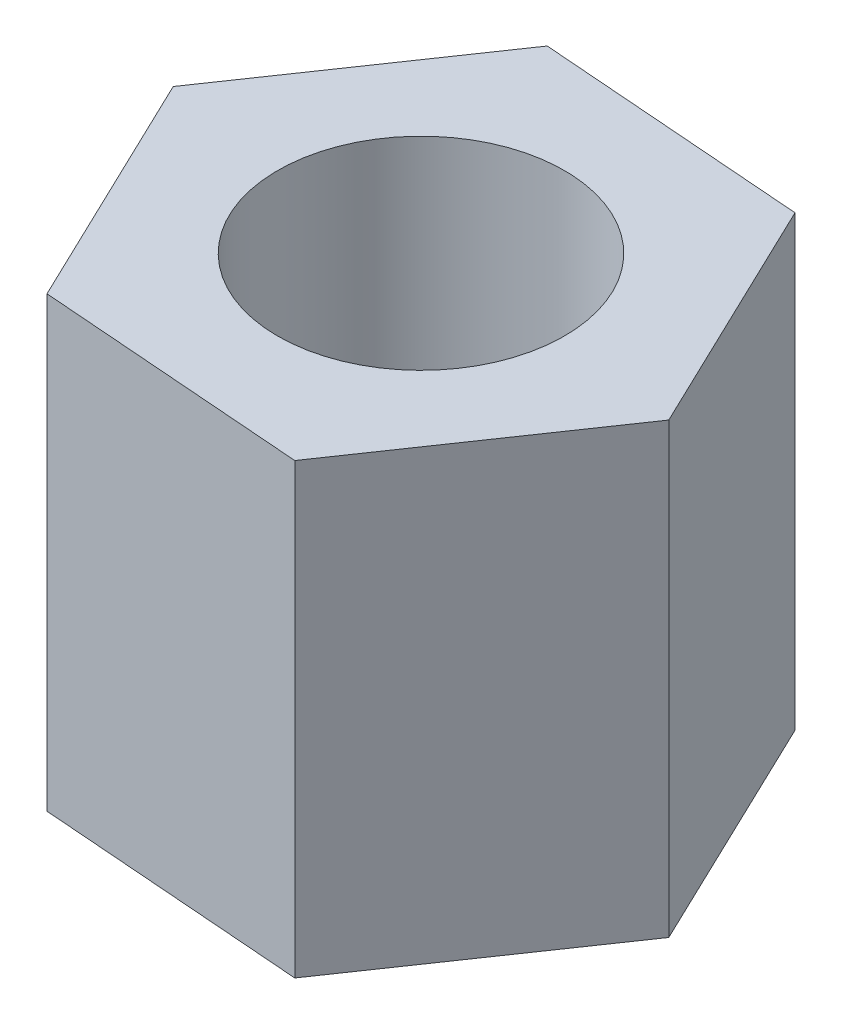
ISO-10303-21;
HEADER;
FILE_DESCRIPTION(('STEP AP214'),'2;1');
FILE_NAME('part.step','',(''),(''),'','','');
FILE_SCHEMA(('AUTOMOTIVE_DESIGN { 1 0 10303 214 1 1 1 1 }'));
ENDSEC;
DATA;
#1=APPLICATION_CONTEXT('core data for automotive mechanical design processes');
#2=APPLICATION_PROTOCOL_DEFINITION('international standard','automotive_design',2000,#1);
#3=PRODUCT_CONTEXT('',#1,'mechanical');
#4=PRODUCT('Part','Part','',(#3));
#5=PRODUCT_RELATED_PRODUCT_CATEGORY('part','',(#4));
#6=PRODUCT_DEFINITION_FORMATION('','',#4);
#7=PRODUCT_DEFINITION_CONTEXT('part definition',#1,'design');
#8=PRODUCT_DEFINITION('design','',#6,#7);
#9=PRODUCT_DEFINITION_SHAPE('','',#8);
#10=(LENGTH_UNIT() NAMED_UNIT(*) SI_UNIT(.MILLI.,.METRE.));
#11=(NAMED_UNIT(*) PLANE_ANGLE_UNIT() SI_UNIT($,.RADIAN.));
#12=(NAMED_UNIT(*) SI_UNIT($,.STERADIAN.) SOLID_ANGLE_UNIT());
#13=UNCERTAINTY_MEASURE_WITH_UNIT(LENGTH_MEASURE(1.E-05),#10,'distance_accuracy_value','');
#14=(GEOMETRIC_REPRESENTATION_CONTEXT(3) GLOBAL_UNCERTAINTY_ASSIGNED_CONTEXT((#13)) GLOBAL_UNIT_ASSIGNED_CONTEXT((#10,
#11,#12)) REPRESENTATION_CONTEXT('',''));
#15=CARTESIAN_POINT('',(0.,0.,0.));
#16=DIRECTION('',(0.,0.,1.));
#17=DIRECTION('',(1.,0.,0.));
#18=AXIS2_PLACEMENT_3D('',#15,#16,#17);
#19=CARTESIAN_POINT('',(0.,5.,0.));
#20=DIRECTION('',(0.,1.,0.));
#21=DIRECTION('',(0.,0.,1.));
#22=AXIS2_PLACEMENT_3D('',#19,#20,#21);
#23=PLANE('',#22);
#24=DIRECTION('',(0.997087277509707,0.,0.0762690043745235));
#25=VECTOR('',#24,1.);
#26=CARTESIAN_POINT('',(-1.69503779237079,5.,2.47793870298845));
#27=LINE('',#26,#25);
#28=CARTESIAN_POINT('',(-1.69503779237079,5.,2.47793870298845));
#29=VERTEX_POINT('',#28);
#30=CARTESIAN_POINT('',(1.29843896962327,5.,2.70691514006202));
#31=VERTEX_POINT('',#30);
#32=EDGE_CURVE('E152',#29,#31,#27,.T.);
#33=ORIENTED_EDGE('',*,*,#32,.T.);
#34=DIRECTION('',(0.564594534064537,0.,-0.825368409926409));
#35=VECTOR('',#34,1.);
#36=CARTESIAN_POINT('',(1.29843896962327,5.,2.70691514006202));
#37=LINE('',#36,#35);
#38=CARTESIAN_POINT('',(2.99347676199406,5.,0.22897643707357));
#39=VERTEX_POINT('',#38);
#40=EDGE_CURVE('E100',#31,#39,#37,.T.);
#41=ORIENTED_EDGE('',*,*,#40,.T.);
#42=DIRECTION('',(-0.43249274344517,0.,-0.901637414300932));
#43=VECTOR('',#42,1.);
#44=CARTESIAN_POINT('',(2.99347676199406,5.,0.22897643707357));
#45=LINE('',#44,#43);
#46=CARTESIAN_POINT('',(1.69503779237079,5.,-2.47793870298845));
#47=VERTEX_POINT('',#46);
#48=EDGE_CURVE('E113',#39,#47,#45,.T.);
#49=ORIENTED_EDGE('',*,*,#48,.T.);
#50=DIRECTION('',(-0.997087277509707,0.,-0.0762690043745234));
#51=VECTOR('',#50,1.);
#52=CARTESIAN_POINT('',(1.69503779237079,5.,-2.47793870298845));
#53=LINE('',#52,#51);
#54=CARTESIAN_POINT('',(-1.29843896962327,5.,-2.70691514006202));
#55=VERTEX_POINT('',#54);
#56=EDGE_CURVE('E107',#47,#55,#53,.T.);
#57=ORIENTED_EDGE('',*,*,#56,.T.);
#58=DIRECTION('',(-0.564594534064537,0.,0.825368409926409));
#59=VECTOR('',#58,1.);
#60=CARTESIAN_POINT('',(-1.29843896962327,5.,-2.70691514006202));
#61=LINE('',#60,#59);
#62=CARTESIAN_POINT('',(-2.99347676199406,5.,-0.228976437073569));
#63=VERTEX_POINT('',#62);
#64=EDGE_CURVE('E111',#55,#63,#61,.T.);
#65=ORIENTED_EDGE('',*,*,#64,.T.);
#66=DIRECTION('',(0.43249274344517,0.,0.901637414300932));
#67=VECTOR('',#66,1.);
#68=CARTESIAN_POINT('',(-2.99347676199406,5.,-0.228976437073569));
#69=LINE('',#68,#67);
#70=EDGE_CURVE('E63',#63,#29,#69,.T.);
#71=ORIENTED_EDGE('',*,*,#70,.T.);
#72=EDGE_LOOP('',(#33,#41,#49,#57,#65,#71));
#73=FACE_BOUND('',#72,.T.);
#74=CARTESIAN_POINT('',(0.,5.,0.));
#75=DIRECTION('',(0.,1.,0.));
#76=DIRECTION('',(0.,0.,1.));
#77=AXIS2_PLACEMENT_3D('',#74,#75,#76);
#78=CIRCLE('',#77,1.6);
#79=CARTESIAN_POINT('',(0.,5.,1.6));
#80=VERTEX_POINT('',#79);
#81=EDGE_CURVE('E140',#80,#80,#78,.T.);
#82=ORIENTED_EDGE('',*,*,#81,.F.);
#83=EDGE_LOOP('',(#82));
#84=FACE_BOUND('',#83,.T.);
#85=ADVANCED_FACE('F45',(#73,#84),#23,.T.);
#86=CARTESIAN_POINT('',(0.,0.,0.));
#87=DIRECTION('',(0.,1.,0.));
#88=DIRECTION('',(0.,0.,1.));
#89=AXIS2_PLACEMENT_3D('',#86,#87,#88);
#90=PLANE('',#89);
#91=DIRECTION('',(0.997087277509707,0.,0.0762690043745235));
#92=VECTOR('',#91,1.);
#93=CARTESIAN_POINT('',(-1.69503779237079,0.,2.47793870298845));
#94=LINE('',#93,#92);
#95=CARTESIAN_POINT('',(-1.69503779237079,0.,2.47793870298845));
#96=VERTEX_POINT('',#95);
#97=CARTESIAN_POINT('',(1.29843896962327,0.,2.70691514006202));
#98=VERTEX_POINT('',#97);
#99=EDGE_CURVE('E135',#96,#98,#94,.T.);
#100=ORIENTED_EDGE('',*,*,#99,.F.);
#101=DIRECTION('',(0.43249274344517,0.,0.901637414300932));
#102=VECTOR('',#101,1.);
#103=CARTESIAN_POINT('',(-2.99347676199406,0.,-0.228976437073569));
#104=LINE('',#103,#102);
#105=CARTESIAN_POINT('',(-2.99347676199406,0.,-0.228976437073569));
#106=VERTEX_POINT('',#105);
#107=EDGE_CURVE('E92',#106,#96,#104,.T.);
#108=ORIENTED_EDGE('',*,*,#107,.F.);
#109=DIRECTION('',(-0.564594534064537,0.,0.825368409926409));
#110=VECTOR('',#109,1.);
#111=CARTESIAN_POINT('',(-1.29843896962327,0.,-2.70691514006202));
#112=LINE('',#111,#110);
#113=CARTESIAN_POINT('',(-1.29843896962327,0.,-2.70691514006202));
#114=VERTEX_POINT('',#113);
#115=EDGE_CURVE('E86',#114,#106,#112,.T.);
#116=ORIENTED_EDGE('',*,*,#115,.F.);
#117=DIRECTION('',(-0.997087277509707,0.,-0.0762690043745234));
#118=VECTOR('',#117,1.);
#119=CARTESIAN_POINT('',(1.69503779237079,0.,-2.47793870298845));
#120=LINE('',#119,#118);
#121=CARTESIAN_POINT('',(1.69503779237079,0.,-2.47793870298845));
#122=VERTEX_POINT('',#121);
#123=EDGE_CURVE('E122',#122,#114,#120,.T.);
#124=ORIENTED_EDGE('',*,*,#123,.F.);
#125=DIRECTION('',(-0.43249274344517,0.,-0.901637414300932));
#126=VECTOR('',#125,1.);
#127=CARTESIAN_POINT('',(2.99347676199406,0.,0.22897643707357));
#128=LINE('',#127,#126);
#129=CARTESIAN_POINT('',(2.99347676199406,0.,0.22897643707357));
#130=VERTEX_POINT('',#129);
#131=EDGE_CURVE('E143',#130,#122,#128,.T.);
#132=ORIENTED_EDGE('',*,*,#131,.F.);
#133=DIRECTION('',(0.564594534064537,0.,-0.825368409926409));
#134=VECTOR('',#133,1.);
#135=CARTESIAN_POINT('',(1.29843896962327,0.,2.70691514006202));
#136=LINE('',#135,#134);
#137=EDGE_CURVE('E139',#98,#130,#136,.T.);
#138=ORIENTED_EDGE('',*,*,#137,.F.);
#139=EDGE_LOOP('',(#100,#108,#116,#124,#132,#138));
#140=FACE_BOUND('',#139,.T.);
#141=CARTESIAN_POINT('',(0.,0.,0.));
#142=DIRECTION('',(0.,1.,0.));
#143=DIRECTION('',(0.,0.,1.));
#144=AXIS2_PLACEMENT_3D('',#141,#142,#143);
#145=CIRCLE('',#144,1.6);
#146=CARTESIAN_POINT('',(0.,0.,1.6));
#147=VERTEX_POINT('',#146);
#148=EDGE_CURVE('E249',#147,#147,#145,.T.);
#149=ORIENTED_EDGE('',*,*,#148,.T.);
#150=EDGE_LOOP('',(#149));
#151=FACE_BOUND('',#150,.T.);
#152=ADVANCED_FACE('F165',(#140,#151),#90,.F.);
#153=CARTESIAN_POINT('',(-1.69503779237079,5.,2.47793870298845));
#154=DIRECTION('',(0.0762690043745235,0.,-0.997087277509707));
#155=DIRECTION('',(-0.997087277509707,0.,-0.0762690043745235));
#156=AXIS2_PLACEMENT_3D('',#153,#154,#155);
#157=PLANE('',#156);
#158=ORIENTED_EDGE('',*,*,#99,.T.);
#159=DIRECTION('',(0.,-1.,0.));
#160=VECTOR('',#159,1.);
#161=CARTESIAN_POINT('',(1.29843896962327,5.,2.70691514006202));
#162=LINE('',#161,#160);
#163=EDGE_CURVE('E11',#31,#98,#162,.T.);
#164=ORIENTED_EDGE('',*,*,#163,.F.);
#165=ORIENTED_EDGE('',*,*,#32,.F.);
#166=DIRECTION('',(0.,-1.,0.));
#167=VECTOR('',#166,1.);
#168=CARTESIAN_POINT('',(-1.69503779237079,5.,2.47793870298845));
#169=LINE('',#168,#167);
#170=EDGE_CURVE('E131',#29,#96,#169,.T.);
#171=ORIENTED_EDGE('',*,*,#170,.T.);
#172=EDGE_LOOP('',(#158,#164,#165,#171));
#173=FACE_BOUND('',#172,.T.);
#174=ADVANCED_FACE('F47',(#173),#157,.F.);
#175=CARTESIAN_POINT('',(1.29843896962327,5.,2.70691514006202));
#176=DIRECTION('',(-0.825368409926409,0.,-0.564594534064537));
#177=DIRECTION('',(-0.564594534064537,0.,0.825368409926409));
#178=AXIS2_PLACEMENT_3D('',#175,#176,#177);
#179=PLANE('',#178);
#180=ORIENTED_EDGE('',*,*,#137,.T.);
#181=DIRECTION('',(0.,-1.,0.));
#182=VECTOR('',#181,1.);
#183=CARTESIAN_POINT('',(2.99347676199406,5.,0.22897643707357));
#184=LINE('',#183,#182);
#185=EDGE_CURVE('E55',#39,#130,#184,.T.);
#186=ORIENTED_EDGE('',*,*,#185,.F.);
#187=ORIENTED_EDGE('',*,*,#40,.F.);
#188=ORIENTED_EDGE('',*,*,#163,.T.);
#189=EDGE_LOOP('',(#180,#186,#187,#188));
#190=FACE_BOUND('',#189,.T.);
#191=ADVANCED_FACE('F190',(#190),#179,.F.);
#192=CARTESIAN_POINT('',(2.99347676199406,5.,0.22897643707357));
#193=DIRECTION('',(-0.901637414300932,0.,0.43249274344517));
#194=DIRECTION('',(0.43249274344517,0.,0.901637414300932));
#195=AXIS2_PLACEMENT_3D('',#192,#193,#194);
#196=PLANE('',#195);
#197=ORIENTED_EDGE('',*,*,#131,.T.);
#198=DIRECTION('',(0.,-1.,0.));
#199=VECTOR('',#198,1.);
#200=CARTESIAN_POINT('',(1.69503779237079,5.,-2.47793870298845));
#201=LINE('',#200,#199);
#202=EDGE_CURVE('E124',#47,#122,#201,.T.);
#203=ORIENTED_EDGE('',*,*,#202,.F.);
#204=ORIENTED_EDGE('',*,*,#48,.F.);
#205=ORIENTED_EDGE('',*,*,#185,.T.);
#206=EDGE_LOOP('',(#197,#203,#204,#205));
#207=FACE_BOUND('',#206,.T.);
#208=ADVANCED_FACE('F162',(#207),#196,.F.);
#209=CARTESIAN_POINT('',(1.69503779237079,5.,-2.47793870298845));
#210=DIRECTION('',(-0.0762690043745234,0.,0.997087277509707));
#211=DIRECTION('',(0.997087277509707,0.,0.0762690043745234));
#212=AXIS2_PLACEMENT_3D('',#209,#210,#211);
#213=PLANE('',#212);
#214=ORIENTED_EDGE('',*,*,#123,.T.);
#215=DIRECTION('',(0.,-1.,0.));
#216=VECTOR('',#215,1.);
#217=CARTESIAN_POINT('',(-1.29843896962327,5.,-2.70691514006202));
#218=LINE('',#217,#216);
#219=EDGE_CURVE('E119',#55,#114,#218,.T.);
#220=ORIENTED_EDGE('',*,*,#219,.F.);
#221=ORIENTED_EDGE('',*,*,#56,.F.);
#222=ORIENTED_EDGE('',*,*,#202,.T.);
#223=EDGE_LOOP('',(#214,#220,#221,#222));
#224=FACE_BOUND('',#223,.T.);
#225=ADVANCED_FACE('F120',(#224),#213,.F.);
#226=CARTESIAN_POINT('',(-1.29843896962327,5.,-2.70691514006202));
#227=DIRECTION('',(0.825368409926409,0.,0.564594534064537));
#228=DIRECTION('',(0.564594534064537,0.,-0.825368409926409));
#229=AXIS2_PLACEMENT_3D('',#226,#227,#228);
#230=PLANE('',#229);
#231=ORIENTED_EDGE('',*,*,#115,.T.);
#232=DIRECTION('',(0.,-1.,0.));
#233=VECTOR('',#232,1.);
#234=CARTESIAN_POINT('',(-2.99347676199406,5.,-0.228976437073569));
#235=LINE('',#234,#233);
#236=EDGE_CURVE('E125',#63,#106,#235,.T.);
#237=ORIENTED_EDGE('',*,*,#236,.F.);
#238=ORIENTED_EDGE('',*,*,#64,.F.);
#239=ORIENTED_EDGE('',*,*,#219,.T.);
#240=EDGE_LOOP('',(#231,#237,#238,#239));
#241=FACE_BOUND('',#240,.T.);
#242=ADVANCED_FACE('F127',(#241),#230,.F.);
#243=CARTESIAN_POINT('',(-2.99347676199406,5.,-0.228976437073569));
#244=DIRECTION('',(0.901637414300932,0.,-0.43249274344517));
#245=DIRECTION('',(-0.43249274344517,0.,-0.901637414300932));
#246=AXIS2_PLACEMENT_3D('',#243,#244,#245);
#247=PLANE('',#246);
#248=ORIENTED_EDGE('',*,*,#107,.T.);
#249=ORIENTED_EDGE('',*,*,#170,.F.);
#250=ORIENTED_EDGE('',*,*,#70,.F.);
#251=ORIENTED_EDGE('',*,*,#236,.T.);
#252=EDGE_LOOP('',(#248,#249,#250,#251));
#253=FACE_BOUND('',#252,.T.);
#254=ADVANCED_FACE('F170',(#253),#247,.F.);
#255=CARTESIAN_POINT('',(0.,5.,0.));
#256=DIRECTION('',(0.,-1.,0.));
#257=DIRECTION('',(0.,0.,-1.));
#258=AXIS2_PLACEMENT_3D('',#255,#256,#257);
#259=CYLINDRICAL_SURFACE('',#258,1.6);
#260=ORIENTED_EDGE('',*,*,#81,.T.);
#261=EDGE_LOOP('',(#260));
#262=FACE_BOUND('',#261,.T.);
#263=ORIENTED_EDGE('',*,*,#148,.F.);
#264=EDGE_LOOP('',(#263));
#265=FACE_BOUND('',#264,.T.);
#266=ADVANCED_FACE('F172',(#262,#265),#259,.F.);
#267=CLOSED_SHELL('',(#85,#152,#174,#191,#208,#225,#242,#254,#266));
#268=MANIFOLD_SOLID_BREP('B2',#267);
#269=ADVANCED_BREP_SHAPE_REPRESENTATION('',(#18,#268),#14);
#270=SHAPE_DEFINITION_REPRESENTATION(#9,#269);
ENDSEC;
END-ISO-10303-21;
